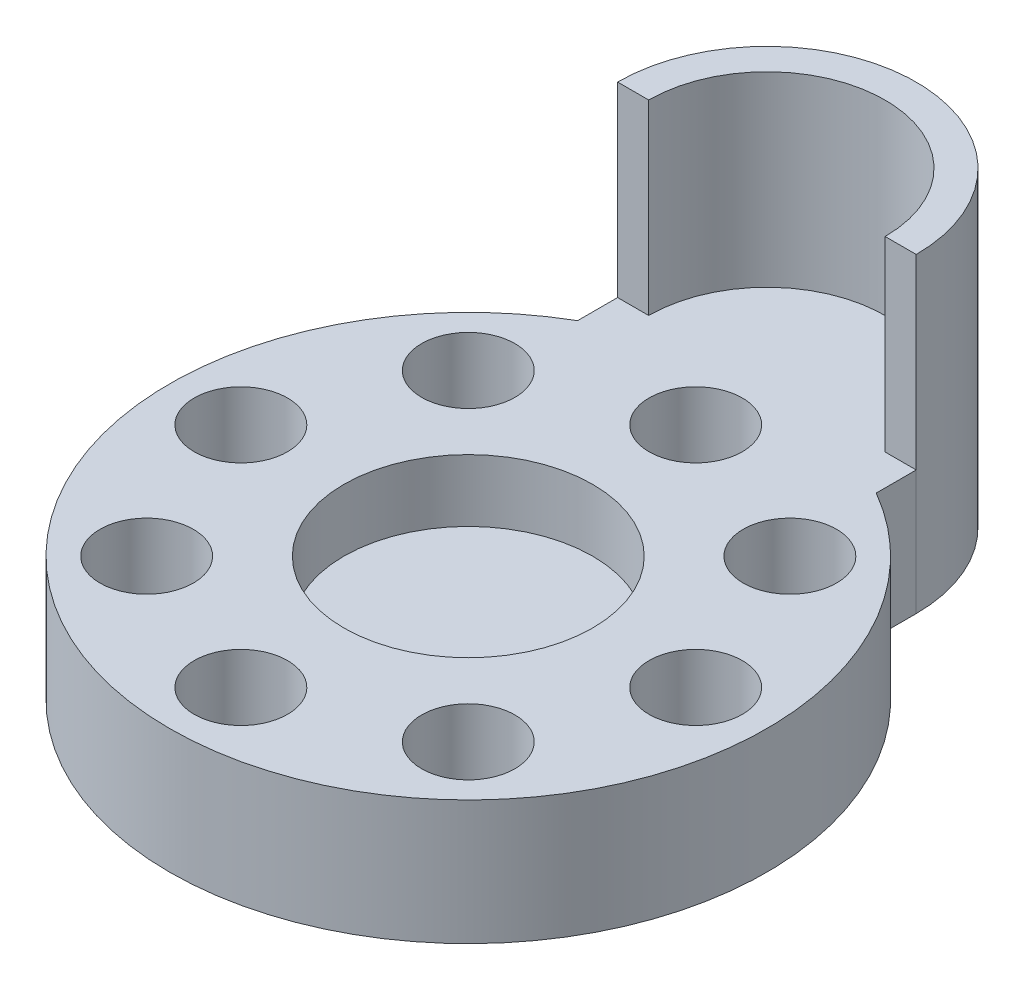
ISO-10303-21;
HEADER;
FILE_DESCRIPTION(('STEP AP214'),'2;1');
FILE_NAME('part.step','',(''),(''),'','','');
FILE_SCHEMA(('AUTOMOTIVE_DESIGN { 1 0 10303 214 1 1 1 1 }'));
ENDSEC;
DATA;
#1=APPLICATION_CONTEXT('core data for automotive mechanical design processes');
#2=APPLICATION_PROTOCOL_DEFINITION('international standard','automotive_design',2000,#1);
#3=PRODUCT_CONTEXT('',#1,'mechanical');
#4=PRODUCT('Part','Part','',(#3));
#5=PRODUCT_RELATED_PRODUCT_CATEGORY('part','',(#4));
#6=PRODUCT_DEFINITION_FORMATION('','',#4);
#7=PRODUCT_DEFINITION_CONTEXT('part definition',#1,'design');
#8=PRODUCT_DEFINITION('design','',#6,#7);
#9=PRODUCT_DEFINITION_SHAPE('','',#8);
#10=(LENGTH_UNIT() NAMED_UNIT(*) SI_UNIT(.MILLI.,.METRE.));
#11=(NAMED_UNIT(*) PLANE_ANGLE_UNIT() SI_UNIT($,.RADIAN.));
#12=(NAMED_UNIT(*) SI_UNIT($,.STERADIAN.) SOLID_ANGLE_UNIT());
#13=UNCERTAINTY_MEASURE_WITH_UNIT(LENGTH_MEASURE(1.E-05),#10,'distance_accuracy_value','');
#14=(GEOMETRIC_REPRESENTATION_CONTEXT(3) GLOBAL_UNCERTAINTY_ASSIGNED_CONTEXT((#13)) GLOBAL_UNIT_ASSIGNED_CONTEXT((#10,
#11,#12)) REPRESENTATION_CONTEXT('',''));
#15=CARTESIAN_POINT('',(0.,0.,0.));
#16=DIRECTION('',(0.,0.,1.));
#17=DIRECTION('',(1.,0.,0.));
#18=AXIS2_PLACEMENT_3D('',#15,#16,#17);
#19=CARTESIAN_POINT('',(0.,20.,0.));
#20=DIRECTION('',(0.,-1.,0.));
#21=DIRECTION('',(0.,0.,-1.));
#22=AXIS2_PLACEMENT_3D('',#19,#20,#21);
#23=CYLINDRICAL_SURFACE('',#22,48.);
#24=CARTESIAN_POINT('',(0.,0.,0.));
#25=DIRECTION('',(0.,1.,0.));
#26=DIRECTION('',(0.,0.,1.));
#27=AXIS2_PLACEMENT_3D('',#24,#25,#26);
#28=CIRCLE('',#27,48.);
#29=CARTESIAN_POINT('',(-24.,0.,-41.5692193816531));
#30=VERTEX_POINT('',#29);
#31=CARTESIAN_POINT('',(24.,0.,-41.5692193816531));
#32=VERTEX_POINT('',#31);
#33=EDGE_CURVE('E169',#30,#32,#28,.T.);
#34=ORIENTED_EDGE('',*,*,#33,.T.);
#35=DIRECTION('',(0.,-1.,0.));
#36=VECTOR('',#35,1.);
#37=CARTESIAN_POINT('',(24.,20.,-41.5692193816531));
#38=LINE('',#37,#36);
#39=CARTESIAN_POINT('',(24.,20.,-41.5692193816531));
#40=VERTEX_POINT('',#39);
#41=EDGE_CURVE('E11',#40,#32,#38,.T.);
#42=ORIENTED_EDGE('',*,*,#41,.F.);
#43=CARTESIAN_POINT('',(0.,20.,0.));
#44=DIRECTION('',(0.,1.,0.));
#45=DIRECTION('',(0.,0.,1.));
#46=AXIS2_PLACEMENT_3D('',#43,#44,#45);
#47=CIRCLE('',#46,48.);
#48=CARTESIAN_POINT('',(-24.,20.,-41.5692193816531));
#49=VERTEX_POINT('',#48);
#50=EDGE_CURVE('E172',#49,#40,#47,.T.);
#51=ORIENTED_EDGE('',*,*,#50,.F.);
#52=DIRECTION('',(0.,-1.,0.));
#53=VECTOR('',#52,1.);
#54=CARTESIAN_POINT('',(-24.,20.,-41.5692193816531));
#55=LINE('',#54,#53);
#56=EDGE_CURVE('E180',#49,#30,#55,.T.);
#57=ORIENTED_EDGE('',*,*,#56,.T.);
#58=EDGE_LOOP('',(#34,#42,#51,#57));
#59=FACE_BOUND('',#58,.T.);
#60=ADVANCED_FACE('F33',(#59),#23,.T.);
#61=CARTESIAN_POINT('',(24.,20.,-41.5692193816531));
#62=DIRECTION('',(-1.,0.,0.));
#63=DIRECTION('',(0.,0.,1.));
#64=AXIS2_PLACEMENT_3D('',#61,#62,#63);
#65=PLANE('',#64);
#66=DIRECTION('',(0.,0.,-1.));
#67=VECTOR('',#66,1.);
#68=CARTESIAN_POINT('',(24.,0.,-41.5692193816531));
#69=LINE('',#68,#67);
#70=CARTESIAN_POINT('',(24.,0.,-48.));
#71=VERTEX_POINT('',#70);
#72=EDGE_CURVE('E183',#32,#71,#69,.T.);
#73=ORIENTED_EDGE('',*,*,#72,.T.);
#74=DIRECTION('',(0.,-1.,0.));
#75=VECTOR('',#74,1.);
#76=CARTESIAN_POINT('',(24.,20.,-48.));
#77=LINE('',#76,#75);
#78=CARTESIAN_POINT('',(24.,20.,-48.));
#79=VERTEX_POINT('',#78);
#80=EDGE_CURVE('E40',#79,#71,#77,.T.);
#81=ORIENTED_EDGE('',*,*,#80,.F.);
#82=DIRECTION('',(0.,0.,-1.));
#83=VECTOR('',#82,1.);
#84=CARTESIAN_POINT('',(24.,20.,-41.5692193816531));
#85=LINE('',#84,#83);
#86=EDGE_CURVE('E175',#40,#79,#85,.T.);
#87=ORIENTED_EDGE('',*,*,#86,.F.);
#88=ORIENTED_EDGE('',*,*,#41,.T.);
#89=EDGE_LOOP('',(#73,#81,#87,#88));
#90=FACE_BOUND('',#89,.T.);
#91=ADVANCED_FACE('F231',(#90),#65,.F.);
#92=CARTESIAN_POINT('',(0.,20.,-48.));
#93=DIRECTION('',(0.,-1.,0.));
#94=DIRECTION('',(0.,0.,-1.));
#95=AXIS2_PLACEMENT_3D('',#92,#93,#94);
#96=CYLINDRICAL_SURFACE('',#95,24.);
#97=CARTESIAN_POINT('',(0.,0.,-48.));
#98=DIRECTION('',(0.,1.,0.));
#99=DIRECTION('',(0.,0.,1.));
#100=AXIS2_PLACEMENT_3D('',#97,#98,#99);
#101=CIRCLE('',#100,24.);
#102=CARTESIAN_POINT('',(-24.,0.,-48.));
#103=VERTEX_POINT('',#102);
#104=EDGE_CURVE('E185',#71,#103,#101,.T.);
#105=ORIENTED_EDGE('',*,*,#104,.T.);
#106=DIRECTION('',(0.,-1.,0.));
#107=VECTOR('',#106,1.);
#108=CARTESIAN_POINT('',(-24.,20.,-48.));
#109=LINE('',#108,#107);
#110=CARTESIAN_POINT('',(-24.,20.,-48.));
#111=VERTEX_POINT('',#110);
#112=EDGE_CURVE('E190',#111,#103,#109,.T.);
#113=ORIENTED_EDGE('',*,*,#112,.F.);
#114=DIRECTION('',(0.,-1.,0.));
#115=VECTOR('',#114,1.);
#116=CARTESIAN_POINT('',(-24.,50.,-48.));
#117=LINE('',#116,#115);
#118=CARTESIAN_POINT('',(-24.,50.,-48.));
#119=VERTEX_POINT('',#118);
#120=EDGE_CURVE('E117',#119,#111,#117,.T.);
#121=ORIENTED_EDGE('',*,*,#120,.F.);
#122=CARTESIAN_POINT('',(0.,50.,-48.));
#123=DIRECTION('',(0.,1.,0.));
#124=DIRECTION('',(0.,0.,1.));
#125=AXIS2_PLACEMENT_3D('',#122,#123,#124);
#126=CIRCLE('',#125,24.);
#127=CARTESIAN_POINT('',(24.,50.,-48.));
#128=VERTEX_POINT('',#127);
#129=EDGE_CURVE('E99',#128,#119,#126,.T.);
#130=ORIENTED_EDGE('',*,*,#129,.F.);
#131=DIRECTION('',(0.,-1.,0.));
#132=VECTOR('',#131,1.);
#133=CARTESIAN_POINT('',(24.,50.,-48.));
#134=LINE('',#133,#132);
#135=EDGE_CURVE('E96',#128,#79,#134,.T.);
#136=ORIENTED_EDGE('',*,*,#135,.T.);
#137=ORIENTED_EDGE('',*,*,#80,.T.);
#138=EDGE_LOOP('',(#105,#113,#121,#130,#136,#137));
#139=FACE_BOUND('',#138,.T.);
#140=ADVANCED_FACE('F195',(#139),#96,.T.);
#141=CARTESIAN_POINT('',(-24.,20.,-41.5692193816531));
#142=DIRECTION('',(1.,0.,0.));
#143=DIRECTION('',(0.,0.,-1.));
#144=AXIS2_PLACEMENT_3D('',#141,#142,#143);
#145=PLANE('',#144);
#146=DIRECTION('',(0.,0.,1.));
#147=VECTOR('',#146,1.);
#148=CARTESIAN_POINT('',(-24.,0.,-41.5692193816531));
#149=LINE('',#148,#147);
#150=EDGE_CURVE('E176',#103,#30,#149,.T.);
#151=ORIENTED_EDGE('',*,*,#150,.T.);
#152=ORIENTED_EDGE('',*,*,#56,.F.);
#153=DIRECTION('',(0.,0.,1.));
#154=VECTOR('',#153,1.);
#155=CARTESIAN_POINT('',(-24.,20.,-41.5692193816531));
#156=LINE('',#155,#154);
#157=EDGE_CURVE('E178',#111,#49,#156,.T.);
#158=ORIENTED_EDGE('',*,*,#157,.F.);
#159=ORIENTED_EDGE('',*,*,#112,.T.);
#160=EDGE_LOOP('',(#151,#152,#158,#159));
#161=FACE_BOUND('',#160,.T.);
#162=ADVANCED_FACE('F204',(#161),#145,.F.);
#163=CARTESIAN_POINT('',(0.,20.,0.));
#164=DIRECTION('',(0.,1.,0.));
#165=DIRECTION('',(0.,0.,1.));
#166=AXIS2_PLACEMENT_3D('',#163,#164,#165);
#167=PLANE('',#166);
#168=DIRECTION('',(1.,0.,0.));
#169=VECTOR('',#168,1.);
#170=CARTESIAN_POINT('',(-24.,20.,-48.));
#171=LINE('',#170,#169);
#172=CARTESIAN_POINT('',(-19.,20.,-48.));
#173=VERTEX_POINT('',#172);
#174=EDGE_CURVE('E109',#111,#173,#171,.T.);
#175=ORIENTED_EDGE('',*,*,#174,.F.);
#176=ORIENTED_EDGE('',*,*,#157,.T.);
#177=ORIENTED_EDGE('',*,*,#50,.T.);
#178=ORIENTED_EDGE('',*,*,#86,.T.);
#179=DIRECTION('',(1.,0.,0.));
#180=VECTOR('',#179,1.);
#181=CARTESIAN_POINT('',(19.,20.,-48.));
#182=LINE('',#181,#180);
#183=CARTESIAN_POINT('',(19.,20.,-48.));
#184=VERTEX_POINT('',#183);
#185=EDGE_CURVE('E52',#184,#79,#182,.T.);
#186=ORIENTED_EDGE('',*,*,#185,.F.);
#187=CARTESIAN_POINT('',(0.,20.,-48.));
#188=DIRECTION('',(0.,-1.,0.));
#189=DIRECTION('',(0.,0.,1.));
#190=AXIS2_PLACEMENT_3D('',#187,#188,#189);
#191=CIRCLE('',#190,19.);
#192=EDGE_CURVE('E47',#173,#184,#191,.T.);
#193=ORIENTED_EDGE('',*,*,#192,.F.);
#194=EDGE_LOOP('',(#175,#176,#177,#178,#186,#193));
#195=FACE_BOUND('',#194,.T.);
#196=CARTESIAN_POINT('',(-25.846970264203,20.,-25.8469702642017));
#197=DIRECTION('',(0.,1.,0.));
#198=DIRECTION('',(0.,0.,1.));
#199=AXIS2_PLACEMENT_3D('',#196,#197,#198);
#200=CIRCLE('',#199,7.5);
#201=CARTESIAN_POINT('',(-25.846970264203,20.,-18.3469702642017));
#202=VERTEX_POINT('',#201);
#203=EDGE_CURVE('E112',#202,#202,#200,.T.);
#204=ORIENTED_EDGE('',*,*,#203,.F.);
#205=EDGE_LOOP('',(#204));
#206=FACE_BOUND('',#205,.T.);
#207=CARTESIAN_POINT('',(-36.5531358938882,20.,3.11670804319927E-12));
#208=DIRECTION('',(0.,1.,0.));
#209=DIRECTION('',(0.,0.,1.));
#210=AXIS2_PLACEMENT_3D('',#207,#208,#209);
#211=CIRCLE('',#210,7.5);
#212=CARTESIAN_POINT('',(-36.5531358938882,20.,7.50000000000312));
#213=VERTEX_POINT('',#212);
#214=EDGE_CURVE('E122',#213,#213,#211,.T.);
#215=ORIENTED_EDGE('',*,*,#214,.F.);
#216=EDGE_LOOP('',(#215));
#217=FACE_BOUND('',#216,.T.);
#218=CARTESIAN_POINT('',(-25.8469702641986,20.,25.8469702642061));
#219=DIRECTION('',(0.,1.,0.));
#220=DIRECTION('',(0.,0.,1.));
#221=AXIS2_PLACEMENT_3D('',#218,#219,#220);
#222=CIRCLE('',#221,7.5);
#223=CARTESIAN_POINT('',(-25.8469702641986,20.,33.3469702642061));
#224=VERTEX_POINT('',#223);
#225=EDGE_CURVE('E127',#224,#224,#222,.T.);
#226=ORIENTED_EDGE('',*,*,#225,.F.);
#227=EDGE_LOOP('',(#226));
#228=FACE_BOUND('',#227,.T.);
#229=CARTESIAN_POINT('',(6.22446315022429E-12,20.,36.5531358938913));
#230=DIRECTION('',(0.,1.,0.));
#231=DIRECTION('',(0.,0.,1.));
#232=AXIS2_PLACEMENT_3D('',#229,#230,#231);
#233=CIRCLE('',#232,7.5);
#234=CARTESIAN_POINT('',(6.22446315022429E-12,20.,44.0531358938913));
#235=VERTEX_POINT('',#234);
#236=EDGE_CURVE('E133',#235,#235,#233,.T.);
#237=ORIENTED_EDGE('',*,*,#236,.F.);
#238=EDGE_LOOP('',(#237));
#239=FACE_BOUND('',#238,.T.);
#240=CARTESIAN_POINT('',(25.8469702642092,20.,25.8469702642017));
#241=DIRECTION('',(0.,1.,0.));
#242=DIRECTION('',(0.,0.,1.));
#243=AXIS2_PLACEMENT_3D('',#240,#241,#242);
#244=CIRCLE('',#243,7.5);
#245=CARTESIAN_POINT('',(25.8469702642092,20.,33.3469702642017));
#246=VERTEX_POINT('',#245);
#247=EDGE_CURVE('E139',#246,#246,#244,.T.);
#248=ORIENTED_EDGE('',*,*,#247,.F.);
#249=EDGE_LOOP('',(#248));
#250=FACE_BOUND('',#249,.T.);
#251=CARTESIAN_POINT('',(36.5531358938944,20.,-3.11223157511214E-12));
#252=DIRECTION('',(0.,1.,0.));
#253=DIRECTION('',(0.,0.,1.));
#254=AXIS2_PLACEMENT_3D('',#251,#252,#253);
#255=CIRCLE('',#254,7.5);
#256=CARTESIAN_POINT('',(36.5531358938944,20.,7.49999999999689));
#257=VERTEX_POINT('',#256);
#258=EDGE_CURVE('E145',#257,#257,#255,.T.);
#259=ORIENTED_EDGE('',*,*,#258,.F.);
#260=EDGE_LOOP('',(#259));
#261=FACE_BOUND('',#260,.T.);
#262=CARTESIAN_POINT('',(25.8469702642048,20.,-25.8469702642061));
#263=DIRECTION('',(0.,1.,0.));
#264=DIRECTION('',(0.,0.,1.));
#265=AXIS2_PLACEMENT_3D('',#262,#263,#264);
#266=CIRCLE('',#265,7.5);
#267=CARTESIAN_POINT('',(25.8469702642048,20.,-18.3469702642061));
#268=VERTEX_POINT('',#267);
#269=EDGE_CURVE('E151',#268,#268,#266,.T.);
#270=ORIENTED_EDGE('',*,*,#269,.F.);
#271=EDGE_LOOP('',(#270));
#272=FACE_BOUND('',#271,.T.);
#273=CARTESIAN_POINT('',(0.,20.,-36.5531358938913));
#274=DIRECTION('',(0.,1.,0.));
#275=DIRECTION('',(0.,0.,1.));
#276=AXIS2_PLACEMENT_3D('',#273,#274,#275);
#277=CIRCLE('',#276,7.5);
#278=CARTESIAN_POINT('',(0.,20.,-29.0531358938913));
#279=VERTEX_POINT('',#278);
#280=EDGE_CURVE('E157',#279,#279,#277,.T.);
#281=ORIENTED_EDGE('',*,*,#280,.F.);
#282=EDGE_LOOP('',(#281));
#283=FACE_BOUND('',#282,.T.);
#284=CARTESIAN_POINT('',(0.,20.,0.));
#285=DIRECTION('',(0.,1.,0.));
#286=DIRECTION('',(0.,0.,1.));
#287=AXIS2_PLACEMENT_3D('',#284,#285,#286);
#288=CIRCLE('',#287,20.);
#289=CARTESIAN_POINT('',(0.,20.,20.));
#290=VERTEX_POINT('',#289);
#291=EDGE_CURVE('E163',#290,#290,#288,.T.);
#292=ORIENTED_EDGE('',*,*,#291,.F.);
#293=EDGE_LOOP('',(#292));
#294=FACE_BOUND('',#293,.T.);
#295=ADVANCED_FACE('F209',(#195,#206,#217,#228,#239,#250,#261,#272,#283,#294),#167,.T.);
#296=CARTESIAN_POINT('',(0.,0.,0.));
#297=DIRECTION('',(0.,1.,0.));
#298=DIRECTION('',(0.,0.,1.));
#299=AXIS2_PLACEMENT_3D('',#296,#297,#298);
#300=PLANE('',#299);
#301=CARTESIAN_POINT('',(-25.846970264203,0.,-25.8469702642017));
#302=DIRECTION('',(0.,1.,0.));
#303=DIRECTION('',(0.,0.,1.));
#304=AXIS2_PLACEMENT_3D('',#301,#302,#303);
#305=CIRCLE('',#304,7.5);
#306=CARTESIAN_POINT('',(-25.846970264203,0.,-18.3469702642017));
#307=VERTEX_POINT('',#306);
#308=EDGE_CURVE('E115',#307,#307,#305,.T.);
#309=ORIENTED_EDGE('',*,*,#308,.T.);
#310=EDGE_LOOP('',(#309));
#311=FACE_BOUND('',#310,.T.);
#312=CARTESIAN_POINT('',(-36.5531358938882,0.,3.11670804319927E-12));
#313=DIRECTION('',(0.,1.,0.));
#314=DIRECTION('',(0.,0.,1.));
#315=AXIS2_PLACEMENT_3D('',#312,#313,#314);
#316=CIRCLE('',#315,7.5);
#317=CARTESIAN_POINT('',(-36.5531358938882,0.,7.50000000000312));
#318=VERTEX_POINT('',#317);
#319=EDGE_CURVE('E124',#318,#318,#316,.T.);
#320=ORIENTED_EDGE('',*,*,#319,.T.);
#321=EDGE_LOOP('',(#320));
#322=FACE_BOUND('',#321,.T.);
#323=CARTESIAN_POINT('',(-25.8469702641986,0.,25.8469702642061));
#324=DIRECTION('',(0.,1.,0.));
#325=DIRECTION('',(0.,0.,1.));
#326=AXIS2_PLACEMENT_3D('',#323,#324,#325);
#327=CIRCLE('',#326,7.5);
#328=CARTESIAN_POINT('',(-25.8469702641986,0.,33.3469702642061));
#329=VERTEX_POINT('',#328);
#330=EDGE_CURVE('E130',#329,#329,#327,.T.);
#331=ORIENTED_EDGE('',*,*,#330,.T.);
#332=EDGE_LOOP('',(#331));
#333=FACE_BOUND('',#332,.T.);
#334=CARTESIAN_POINT('',(6.22446315022429E-12,0.,36.5531358938913));
#335=DIRECTION('',(0.,1.,0.));
#336=DIRECTION('',(0.,0.,1.));
#337=AXIS2_PLACEMENT_3D('',#334,#335,#336);
#338=CIRCLE('',#337,7.5);
#339=CARTESIAN_POINT('',(6.22446315022429E-12,0.,44.0531358938913));
#340=VERTEX_POINT('',#339);
#341=EDGE_CURVE('E136',#340,#340,#338,.T.);
#342=ORIENTED_EDGE('',*,*,#341,.T.);
#343=EDGE_LOOP('',(#342));
#344=FACE_BOUND('',#343,.T.);
#345=CARTESIAN_POINT('',(25.8469702642092,0.,25.8469702642017));
#346=DIRECTION('',(0.,1.,0.));
#347=DIRECTION('',(0.,0.,1.));
#348=AXIS2_PLACEMENT_3D('',#345,#346,#347);
#349=CIRCLE('',#348,7.5);
#350=CARTESIAN_POINT('',(25.8469702642092,0.,33.3469702642017));
#351=VERTEX_POINT('',#350);
#352=EDGE_CURVE('E142',#351,#351,#349,.T.);
#353=ORIENTED_EDGE('',*,*,#352,.T.);
#354=EDGE_LOOP('',(#353));
#355=FACE_BOUND('',#354,.T.);
#356=CARTESIAN_POINT('',(36.5531358938944,0.,-3.11223157511214E-12));
#357=DIRECTION('',(0.,1.,0.));
#358=DIRECTION('',(0.,0.,1.));
#359=AXIS2_PLACEMENT_3D('',#356,#357,#358);
#360=CIRCLE('',#359,7.5);
#361=CARTESIAN_POINT('',(36.5531358938944,0.,7.49999999999689));
#362=VERTEX_POINT('',#361);
#363=EDGE_CURVE('E148',#362,#362,#360,.T.);
#364=ORIENTED_EDGE('',*,*,#363,.T.);
#365=EDGE_LOOP('',(#364));
#366=FACE_BOUND('',#365,.T.);
#367=CARTESIAN_POINT('',(25.8469702642048,0.,-25.8469702642061));
#368=DIRECTION('',(0.,1.,0.));
#369=DIRECTION('',(0.,0.,1.));
#370=AXIS2_PLACEMENT_3D('',#367,#368,#369);
#371=CIRCLE('',#370,7.5);
#372=CARTESIAN_POINT('',(25.8469702642048,0.,-18.3469702642061));
#373=VERTEX_POINT('',#372);
#374=EDGE_CURVE('E154',#373,#373,#371,.T.);
#375=ORIENTED_EDGE('',*,*,#374,.T.);
#376=EDGE_LOOP('',(#375));
#377=FACE_BOUND('',#376,.T.);
#378=CARTESIAN_POINT('',(0.,0.,-36.5531358938913));
#379=DIRECTION('',(0.,1.,0.));
#380=DIRECTION('',(0.,0.,1.));
#381=AXIS2_PLACEMENT_3D('',#378,#379,#380);
#382=CIRCLE('',#381,7.5);
#383=CARTESIAN_POINT('',(0.,0.,-29.0531358938913));
#384=VERTEX_POINT('',#383);
#385=EDGE_CURVE('E160',#384,#384,#382,.T.);
#386=ORIENTED_EDGE('',*,*,#385,.T.);
#387=EDGE_LOOP('',(#386));
#388=FACE_BOUND('',#387,.T.);
#389=ORIENTED_EDGE('',*,*,#33,.F.);
#390=ORIENTED_EDGE('',*,*,#150,.F.);
#391=ORIENTED_EDGE('',*,*,#104,.F.);
#392=ORIENTED_EDGE('',*,*,#72,.F.);
#393=EDGE_LOOP('',(#389,#390,#391,#392));
#394=FACE_BOUND('',#393,.T.);
#395=ADVANCED_FACE('F201',(#311,#322,#333,#344,#355,#366,#377,#388,#394),#300,.F.);
#396=CARTESIAN_POINT('',(0.,10.,0.));
#397=DIRECTION('',(0.,1.,0.));
#398=DIRECTION('',(0.,0.,1.));
#399=AXIS2_PLACEMENT_3D('',#396,#397,#398);
#400=CYLINDRICAL_SURFACE('',#399,20.);
#401=CARTESIAN_POINT('',(0.,10.,0.));
#402=DIRECTION('',(0.,1.,0.));
#403=DIRECTION('',(0.,0.,1.));
#404=AXIS2_PLACEMENT_3D('',#401,#402,#403);
#405=CIRCLE('',#404,20.);
#406=CARTESIAN_POINT('',(0.,10.,20.));
#407=VERTEX_POINT('',#406);
#408=EDGE_CURVE('E166',#407,#407,#405,.T.);
#409=ORIENTED_EDGE('',*,*,#408,.F.);
#410=EDGE_LOOP('',(#409));
#411=FACE_BOUND('',#410,.T.);
#412=ORIENTED_EDGE('',*,*,#291,.T.);
#413=EDGE_LOOP('',(#412));
#414=FACE_BOUND('',#413,.T.);
#415=ADVANCED_FACE('F244',(#411,#414),#400,.F.);
#416=CARTESIAN_POINT('',(0.,10.,0.));
#417=DIRECTION('',(0.,1.,0.));
#418=DIRECTION('',(0.,0.,1.));
#419=AXIS2_PLACEMENT_3D('',#416,#417,#418);
#420=PLANE('',#419);
#421=ORIENTED_EDGE('',*,*,#408,.T.);
#422=EDGE_LOOP('',(#421));
#423=FACE_BOUND('',#422,.T.);
#424=ADVANCED_FACE('F250',(#423),#420,.T.);
#425=CARTESIAN_POINT('',(0.,0.,-36.5531358938913));
#426=DIRECTION('',(0.,1.,0.));
#427=DIRECTION('',(0.,0.,1.));
#428=AXIS2_PLACEMENT_3D('',#425,#426,#427);
#429=CYLINDRICAL_SURFACE('',#428,7.5);
#430=ORIENTED_EDGE('',*,*,#385,.F.);
#431=EDGE_LOOP('',(#430));
#432=FACE_BOUND('',#431,.T.);
#433=ORIENTED_EDGE('',*,*,#280,.T.);
#434=EDGE_LOOP('',(#433));
#435=FACE_BOUND('',#434,.T.);
#436=ADVANCED_FACE('F254',(#432,#435),#429,.F.);
#437=CARTESIAN_POINT('',(25.8469702642048,0.,-25.8469702642061));
#438=DIRECTION('',(0.,1.,0.));
#439=DIRECTION('',(0.,0.,1.));
#440=AXIS2_PLACEMENT_3D('',#437,#438,#439);
#441=CYLINDRICAL_SURFACE('',#440,7.5);
#442=ORIENTED_EDGE('',*,*,#374,.F.);
#443=EDGE_LOOP('',(#442));
#444=FACE_BOUND('',#443,.T.);
#445=ORIENTED_EDGE('',*,*,#269,.T.);
#446=EDGE_LOOP('',(#445));
#447=FACE_BOUND('',#446,.T.);
#448=ADVANCED_FACE('F258',(#444,#447),#441,.F.);
#449=CARTESIAN_POINT('',(36.5531358938944,0.,-3.11223157511214E-12));
#450=DIRECTION('',(0.,1.,0.));
#451=DIRECTION('',(0.,0.,1.));
#452=AXIS2_PLACEMENT_3D('',#449,#450,#451);
#453=CYLINDRICAL_SURFACE('',#452,7.5);
#454=ORIENTED_EDGE('',*,*,#363,.F.);
#455=EDGE_LOOP('',(#454));
#456=FACE_BOUND('',#455,.T.);
#457=ORIENTED_EDGE('',*,*,#258,.T.);
#458=EDGE_LOOP('',(#457));
#459=FACE_BOUND('',#458,.T.);
#460=ADVANCED_FACE('F262',(#456,#459),#453,.F.);
#461=CARTESIAN_POINT('',(25.8469702642092,0.,25.8469702642017));
#462=DIRECTION('',(0.,1.,0.));
#463=DIRECTION('',(0.,0.,1.));
#464=AXIS2_PLACEMENT_3D('',#461,#462,#463);
#465=CYLINDRICAL_SURFACE('',#464,7.5);
#466=ORIENTED_EDGE('',*,*,#352,.F.);
#467=EDGE_LOOP('',(#466));
#468=FACE_BOUND('',#467,.T.);
#469=ORIENTED_EDGE('',*,*,#247,.T.);
#470=EDGE_LOOP('',(#469));
#471=FACE_BOUND('',#470,.T.);
#472=ADVANCED_FACE('F266',(#468,#471),#465,.F.);
#473=CARTESIAN_POINT('',(6.22446315022429E-12,0.,36.5531358938913));
#474=DIRECTION('',(0.,1.,0.));
#475=DIRECTION('',(0.,0.,1.));
#476=AXIS2_PLACEMENT_3D('',#473,#474,#475);
#477=CYLINDRICAL_SURFACE('',#476,7.5);
#478=ORIENTED_EDGE('',*,*,#341,.F.);
#479=EDGE_LOOP('',(#478));
#480=FACE_BOUND('',#479,.T.);
#481=ORIENTED_EDGE('',*,*,#236,.T.);
#482=EDGE_LOOP('',(#481));
#483=FACE_BOUND('',#482,.T.);
#484=ADVANCED_FACE('F270',(#480,#483),#477,.F.);
#485=CARTESIAN_POINT('',(-25.8469702641986,0.,25.8469702642061));
#486=DIRECTION('',(0.,1.,0.));
#487=DIRECTION('',(0.,0.,1.));
#488=AXIS2_PLACEMENT_3D('',#485,#486,#487);
#489=CYLINDRICAL_SURFACE('',#488,7.5);
#490=ORIENTED_EDGE('',*,*,#330,.F.);
#491=EDGE_LOOP('',(#490));
#492=FACE_BOUND('',#491,.T.);
#493=ORIENTED_EDGE('',*,*,#225,.T.);
#494=EDGE_LOOP('',(#493));
#495=FACE_BOUND('',#494,.T.);
#496=ADVANCED_FACE('F274',(#492,#495),#489,.F.);
#497=CARTESIAN_POINT('',(-36.5531358938882,0.,3.11670804319927E-12));
#498=DIRECTION('',(0.,1.,0.));
#499=DIRECTION('',(0.,0.,1.));
#500=AXIS2_PLACEMENT_3D('',#497,#498,#499);
#501=CYLINDRICAL_SURFACE('',#500,7.5);
#502=ORIENTED_EDGE('',*,*,#319,.F.);
#503=EDGE_LOOP('',(#502));
#504=FACE_BOUND('',#503,.T.);
#505=ORIENTED_EDGE('',*,*,#214,.T.);
#506=EDGE_LOOP('',(#505));
#507=FACE_BOUND('',#506,.T.);
#508=ADVANCED_FACE('F278',(#504,#507),#501,.F.);
#509=CARTESIAN_POINT('',(-25.846970264203,0.,-25.8469702642017));
#510=DIRECTION('',(0.,1.,0.));
#511=DIRECTION('',(0.,0.,1.));
#512=AXIS2_PLACEMENT_3D('',#509,#510,#511);
#513=CYLINDRICAL_SURFACE('',#512,7.5);
#514=ORIENTED_EDGE('',*,*,#308,.F.);
#515=EDGE_LOOP('',(#514));
#516=FACE_BOUND('',#515,.T.);
#517=ORIENTED_EDGE('',*,*,#203,.T.);
#518=EDGE_LOOP('',(#517));
#519=FACE_BOUND('',#518,.T.);
#520=ADVANCED_FACE('F282',(#516,#519),#513,.F.);
#521=CARTESIAN_POINT('',(0.,50.,-48.));
#522=DIRECTION('',(0.,-1.,0.));
#523=DIRECTION('',(0.,0.,-1.));
#524=AXIS2_PLACEMENT_3D('',#521,#522,#523);
#525=CYLINDRICAL_SURFACE('',#524,19.);
#526=ORIENTED_EDGE('',*,*,#192,.T.);
#527=DIRECTION('',(0.,-1.,0.));
#528=VECTOR('',#527,1.);
#529=CARTESIAN_POINT('',(19.,50.,-48.));
#530=LINE('',#529,#528);
#531=CARTESIAN_POINT('',(19.,50.,-48.));
#532=VERTEX_POINT('',#531);
#533=EDGE_CURVE('E94',#532,#184,#530,.T.);
#534=ORIENTED_EDGE('',*,*,#533,.F.);
#535=CARTESIAN_POINT('',(0.,50.,-48.));
#536=DIRECTION('',(0.,-1.,0.));
#537=DIRECTION('',(0.,0.,1.));
#538=AXIS2_PLACEMENT_3D('',#535,#536,#537);
#539=CIRCLE('',#538,19.);
#540=CARTESIAN_POINT('',(-19.,50.,-48.));
#541=VERTEX_POINT('',#540);
#542=EDGE_CURVE('E100',#541,#532,#539,.T.);
#543=ORIENTED_EDGE('',*,*,#542,.F.);
#544=DIRECTION('',(0.,-1.,0.));
#545=VECTOR('',#544,1.);
#546=CARTESIAN_POINT('',(-19.,50.,-48.));
#547=LINE('',#546,#545);
#548=EDGE_CURVE('E215',#541,#173,#547,.T.);
#549=ORIENTED_EDGE('',*,*,#548,.T.);
#550=EDGE_LOOP('',(#526,#534,#543,#549));
#551=FACE_BOUND('',#550,.T.);
#552=ADVANCED_FACE('F111',(#551),#525,.F.);
#553=CARTESIAN_POINT('',(19.,50.,-48.));
#554=DIRECTION('',(0.,0.,-1.));
#555=DIRECTION('',(-1.,0.,0.));
#556=AXIS2_PLACEMENT_3D('',#553,#554,#555);
#557=PLANE('',#556);
#558=ORIENTED_EDGE('',*,*,#185,.T.);
#559=ORIENTED_EDGE('',*,*,#135,.F.);
#560=DIRECTION('',(1.,0.,0.));
#561=VECTOR('',#560,1.);
#562=CARTESIAN_POINT('',(19.,50.,-48.));
#563=LINE('',#562,#561);
#564=EDGE_CURVE('E90',#532,#128,#563,.T.);
#565=ORIENTED_EDGE('',*,*,#564,.F.);
#566=ORIENTED_EDGE('',*,*,#533,.T.);
#567=EDGE_LOOP('',(#558,#559,#565,#566));
#568=FACE_BOUND('',#567,.T.);
#569=ADVANCED_FACE('F92',(#568),#557,.F.);
#570=CARTESIAN_POINT('',(-24.,50.,-48.));
#571=DIRECTION('',(0.,0.,-1.));
#572=DIRECTION('',(-1.,0.,0.));
#573=AXIS2_PLACEMENT_3D('',#570,#571,#572);
#574=PLANE('',#573);
#575=ORIENTED_EDGE('',*,*,#174,.T.);
#576=ORIENTED_EDGE('',*,*,#548,.F.);
#577=DIRECTION('',(1.,0.,0.));
#578=VECTOR('',#577,1.);
#579=CARTESIAN_POINT('',(-24.,50.,-48.));
#580=LINE('',#579,#578);
#581=EDGE_CURVE('E105',#119,#541,#580,.T.);
#582=ORIENTED_EDGE('',*,*,#581,.F.);
#583=ORIENTED_EDGE('',*,*,#120,.T.);
#584=EDGE_LOOP('',(#575,#576,#582,#583));
#585=FACE_BOUND('',#584,.T.);
#586=ADVANCED_FACE('F214',(#585),#574,.F.);
#587=CARTESIAN_POINT('',(0.,50.,-48.));
#588=DIRECTION('',(0.,1.,0.));
#589=DIRECTION('',(0.,0.,1.));
#590=AXIS2_PLACEMENT_3D('',#587,#588,#589);
#591=PLANE('',#590);
#592=ORIENTED_EDGE('',*,*,#542,.T.);
#593=ORIENTED_EDGE('',*,*,#564,.T.);
#594=ORIENTED_EDGE('',*,*,#129,.T.);
#595=ORIENTED_EDGE('',*,*,#581,.T.);
#596=EDGE_LOOP('',(#592,#593,#594,#595));
#597=FACE_BOUND('',#596,.T.);
#598=ADVANCED_FACE('F103',(#597),#591,.T.);
#599=CLOSED_SHELL('',(#60,#91,#140,#162,#295,#395,#415,#424,#436,#448,#460,#472,#484,#496,#508,
#520,#552,#569,#586,#598));
#600=MANIFOLD_SOLID_BREP('B2',#599);
#601=ADVANCED_BREP_SHAPE_REPRESENTATION('',(#18,#600),#14);
#602=SHAPE_DEFINITION_REPRESENTATION(#9,#601);
ENDSEC;
END-ISO-10303-21;
